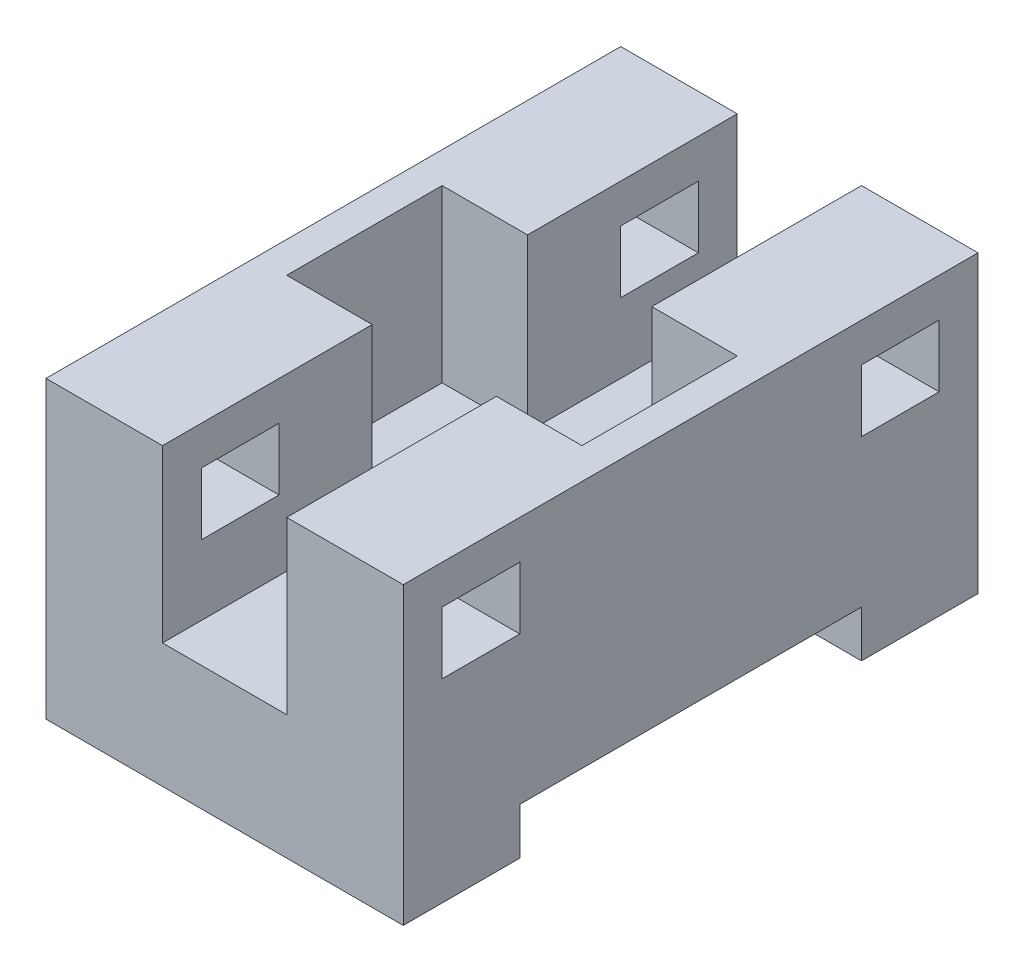
ISO-10303-21;
HEADER;
FILE_DESCRIPTION(('STEP AP214'),'2;1');
FILE_NAME('part.step','',(''),(''),'','','');
FILE_SCHEMA(('AUTOMOTIVE_DESIGN { 1 0 10303 214 1 1 1 1 }'));
ENDSEC;
DATA;
#1=APPLICATION_CONTEXT('core data for automotive mechanical design processes');
#2=APPLICATION_PROTOCOL_DEFINITION('international standard','automotive_design',2000,#1);
#3=PRODUCT_CONTEXT('',#1,'mechanical');
#4=PRODUCT('Part','Part','',(#3));
#5=PRODUCT_RELATED_PRODUCT_CATEGORY('part','',(#4));
#6=PRODUCT_DEFINITION_FORMATION('','',#4);
#7=PRODUCT_DEFINITION_CONTEXT('part definition',#1,'design');
#8=PRODUCT_DEFINITION('design','',#6,#7);
#9=PRODUCT_DEFINITION_SHAPE('','',#8);
#10=(LENGTH_UNIT() NAMED_UNIT(*) SI_UNIT(.MILLI.,.METRE.));
#11=(NAMED_UNIT(*) PLANE_ANGLE_UNIT() SI_UNIT($,.RADIAN.));
#12=(NAMED_UNIT(*) SI_UNIT($,.STERADIAN.) SOLID_ANGLE_UNIT());
#13=UNCERTAINTY_MEASURE_WITH_UNIT(LENGTH_MEASURE(1.E-05),#10,'distance_accuracy_value','');
#14=(GEOMETRIC_REPRESENTATION_CONTEXT(3) GLOBAL_UNCERTAINTY_ASSIGNED_CONTEXT((#13)) GLOBAL_UNIT_ASSIGNED_CONTEXT((#10,
#11,#12)) REPRESENTATION_CONTEXT('',''));
#15=CARTESIAN_POINT('',(0.,0.,0.));
#16=DIRECTION('',(0.,0.,1.));
#17=DIRECTION('',(1.,0.,0.));
#18=AXIS2_PLACEMENT_3D('',#15,#16,#17);
#19=CARTESIAN_POINT('',(23.,19.,37.));
#20=DIRECTION('',(0.,-1.,0.));
#21=DIRECTION('',(0.,0.,-1.));
#22=AXIS2_PLACEMENT_3D('',#19,#20,#21);
#23=PLANE('',#22);
#24=DIRECTION('',(-1.,0.,0.));
#25=VECTOR('',#24,1.);
#26=CARTESIAN_POINT('',(23.,19.,-37.));
#27=LINE('',#26,#25);
#28=CARTESIAN_POINT('',(23.,19.,-37.));
#29=VERTEX_POINT('',#28);
#30=CARTESIAN_POINT('',(8.00000000000001,19.,-37.));
#31=VERTEX_POINT('',#30);
#32=EDGE_CURVE('E529',#29,#31,#27,.T.);
#33=ORIENTED_EDGE('',*,*,#32,.T.);
#34=DIRECTION('',(0.,0.,-1.));
#35=VECTOR('',#34,1.);
#36=CARTESIAN_POINT('',(8.00000000000001,19.,-37.));
#37=LINE('',#36,#35);
#38=CARTESIAN_POINT('',(8.,19.,-10.));
#39=VERTEX_POINT('',#38);
#40=EDGE_CURVE('E387',#39,#31,#37,.T.);
#41=ORIENTED_EDGE('',*,*,#40,.F.);
#42=DIRECTION('',(-1.,0.,0.));
#43=VECTOR('',#42,1.);
#44=CARTESIAN_POINT('',(8.,19.,-10.));
#45=LINE('',#44,#43);
#46=CARTESIAN_POINT('',(19.,19.,-10.));
#47=VERTEX_POINT('',#46);
#48=EDGE_CURVE('E442',#47,#39,#45,.T.);
#49=ORIENTED_EDGE('',*,*,#48,.F.);
#50=DIRECTION('',(0.,0.,-1.));
#51=VECTOR('',#50,1.);
#52=CARTESIAN_POINT('',(19.,19.,-10.));
#53=LINE('',#52,#51);
#54=CARTESIAN_POINT('',(19.,19.,10.));
#55=VERTEX_POINT('',#54);
#56=EDGE_CURVE('E439',#55,#47,#53,.T.);
#57=ORIENTED_EDGE('',*,*,#56,.F.);
#58=DIRECTION('',(1.,0.,0.));
#59=VECTOR('',#58,1.);
#60=CARTESIAN_POINT('',(8.,19.,10.));
#61=LINE('',#60,#59);
#62=CARTESIAN_POINT('',(8.,19.,10.));
#63=VERTEX_POINT('',#62);
#64=EDGE_CURVE('E436',#63,#55,#61,.T.);
#65=ORIENTED_EDGE('',*,*,#64,.F.);
#66=DIRECTION('',(0.,0.,-1.));
#67=VECTOR('',#66,1.);
#68=CARTESIAN_POINT('',(8.,19.,10.));
#69=LINE('',#68,#67);
#70=CARTESIAN_POINT('',(8.,19.,37.));
#71=VERTEX_POINT('',#70);
#72=EDGE_CURVE('E433',#71,#63,#69,.T.);
#73=ORIENTED_EDGE('',*,*,#72,.F.);
#74=DIRECTION('',(-1.,0.,0.));
#75=VECTOR('',#74,1.);
#76=CARTESIAN_POINT('',(23.,19.,37.));
#77=LINE('',#76,#75);
#78=CARTESIAN_POINT('',(23.,19.,37.));
#79=VERTEX_POINT('',#78);
#80=EDGE_CURVE('E525',#79,#71,#77,.T.);
#81=ORIENTED_EDGE('',*,*,#80,.F.);
#82=DIRECTION('',(0.,0.,1.));
#83=VECTOR('',#82,1.);
#84=CARTESIAN_POINT('',(23.,19.,37.));
#85=LINE('',#84,#83);
#86=EDGE_CURVE('E475',#29,#79,#85,.T.);
#87=ORIENTED_EDGE('',*,*,#86,.F.);
#88=EDGE_LOOP('',(#33,#41,#49,#57,#65,#73,#81,#87));
#89=FACE_BOUND('',#88,.T.);
#90=ADVANCED_FACE('F39',(#89),#23,.F.);
#91=CARTESIAN_POINT('',(23.,19.,-37.));
#92=DIRECTION('',(0.,0.,1.));
#93=DIRECTION('',(0.,-1.,0.));
#94=AXIS2_PLACEMENT_3D('',#91,#92,#93);
#95=PLANE('',#94);
#96=CARTESIAN_POINT('',(-8.00000000000001,19.,-37.));
#97=VERTEX_POINT('',#96);
#98=CARTESIAN_POINT('',(-23.,19.,-37.));
#99=VERTEX_POINT('',#98);
#100=EDGE_CURVE('E528',#97,#99,#27,.T.);
#101=ORIENTED_EDGE('',*,*,#100,.F.);
#102=DIRECTION('',(0.,1.,0.));
#103=VECTOR('',#102,1.);
#104=CARTESIAN_POINT('',(-8.00000000000001,-3.,-37.));
#105=LINE('',#104,#103);
#106=CARTESIAN_POINT('',(-8.00000000000001,-3.,-37.));
#107=VERTEX_POINT('',#106);
#108=EDGE_CURVE('E446',#107,#97,#105,.T.);
#109=ORIENTED_EDGE('',*,*,#108,.F.);
#110=DIRECTION('',(-1.,0.,0.));
#111=VECTOR('',#110,1.);
#112=CARTESIAN_POINT('',(-8.00000000000001,-3.,-37.));
#113=LINE('',#112,#111);
#114=CARTESIAN_POINT('',(8.00000000000001,-3.,-37.));
#115=VERTEX_POINT('',#114);
#116=EDGE_CURVE('E416',#115,#107,#113,.T.);
#117=ORIENTED_EDGE('',*,*,#116,.F.);
#118=DIRECTION('',(0.,1.,0.));
#119=VECTOR('',#118,1.);
#120=CARTESIAN_POINT('',(8.00000000000001,-3.,-37.));
#121=LINE('',#120,#119);
#122=EDGE_CURVE('E449',#115,#31,#121,.T.);
#123=ORIENTED_EDGE('',*,*,#122,.T.);
#124=ORIENTED_EDGE('',*,*,#32,.F.);
#125=DIRECTION('',(0.,1.,0.));
#126=VECTOR('',#125,1.);
#127=CARTESIAN_POINT('',(23.,19.,-37.));
#128=LINE('',#127,#126);
#129=CARTESIAN_POINT('',(23.,-19.,-37.));
#130=VERTEX_POINT('',#129);
#131=EDGE_CURVE('E472',#130,#29,#128,.T.);
#132=ORIENTED_EDGE('',*,*,#131,.F.);
#133=DIRECTION('',(-1.,0.,0.));
#134=VECTOR('',#133,1.);
#135=CARTESIAN_POINT('',(23.,-19.,-37.));
#136=LINE('',#135,#134);
#137=CARTESIAN_POINT('',(-23.,-19.,-37.));
#138=VERTEX_POINT('',#137);
#139=EDGE_CURVE('E490',#130,#138,#136,.T.);
#140=ORIENTED_EDGE('',*,*,#139,.T.);
#141=DIRECTION('',(0.,1.,0.));
#142=VECTOR('',#141,1.);
#143=CARTESIAN_POINT('',(-23.,19.,-37.));
#144=LINE('',#143,#142);
#145=EDGE_CURVE('E448',#138,#99,#144,.T.);
#146=ORIENTED_EDGE('',*,*,#145,.T.);
#147=EDGE_LOOP('',(#101,#109,#117,#123,#124,#132,#140,#146));
#148=FACE_BOUND('',#147,.T.);
#149=ADVANCED_FACE('F41',(#148),#95,.F.);
#150=DIRECTION('',(-1.,0.,0.));
#151=VECTOR('',#150,1.);
#152=CARTESIAN_POINT('',(-19.,19.,-10.));
#153=LINE('',#152,#151);
#154=CARTESIAN_POINT('',(-8.,19.,-10.));
#155=VERTEX_POINT('',#154);
#156=CARTESIAN_POINT('',(-19.,19.,-10.));
#157=VERTEX_POINT('',#156);
#158=EDGE_CURVE('E422',#155,#157,#153,.T.);
#159=ORIENTED_EDGE('',*,*,#158,.F.);
#160=DIRECTION('',(0.,0.,1.));
#161=VECTOR('',#160,1.);
#162=CARTESIAN_POINT('',(-8.00000000000001,19.,-37.));
#163=LINE('',#162,#161);
#164=EDGE_CURVE('E382',#97,#155,#163,.T.);
#165=ORIENTED_EDGE('',*,*,#164,.F.);
#166=ORIENTED_EDGE('',*,*,#100,.T.);
#167=DIRECTION('',(0.,0.,1.));
#168=VECTOR('',#167,1.);
#169=CARTESIAN_POINT('',(-23.,19.,37.));
#170=LINE('',#169,#168);
#171=CARTESIAN_POINT('',(-23.,19.,37.));
#172=VERTEX_POINT('',#171);
#173=EDGE_CURVE('E493',#99,#172,#170,.T.);
#174=ORIENTED_EDGE('',*,*,#173,.T.);
#175=CARTESIAN_POINT('',(-8.,19.,37.));
#176=VERTEX_POINT('',#175);
#177=EDGE_CURVE('E524',#176,#172,#77,.T.);
#178=ORIENTED_EDGE('',*,*,#177,.F.);
#179=DIRECTION('',(0.,0.,1.));
#180=VECTOR('',#179,1.);
#181=CARTESIAN_POINT('',(-8.,19.,10.));
#182=LINE('',#181,#180);
#183=CARTESIAN_POINT('',(-8.,19.,10.));
#184=VERTEX_POINT('',#183);
#185=EDGE_CURVE('E431',#184,#176,#182,.T.);
#186=ORIENTED_EDGE('',*,*,#185,.F.);
#187=DIRECTION('',(1.,0.,0.));
#188=VECTOR('',#187,1.);
#189=CARTESIAN_POINT('',(-19.,19.,10.));
#190=LINE('',#189,#188);
#191=CARTESIAN_POINT('',(-19.,19.,10.));
#192=VERTEX_POINT('',#191);
#193=EDGE_CURVE('E428',#192,#184,#190,.T.);
#194=ORIENTED_EDGE('',*,*,#193,.F.);
#195=DIRECTION('',(0.,0.,1.));
#196=VECTOR('',#195,1.);
#197=CARTESIAN_POINT('',(-19.,19.,-10.));
#198=LINE('',#197,#196);
#199=EDGE_CURVE('E425',#157,#192,#198,.T.);
#200=ORIENTED_EDGE('',*,*,#199,.F.);
#201=EDGE_LOOP('',(#159,#165,#166,#174,#178,#186,#194,#200));
#202=FACE_BOUND('',#201,.T.);
#203=ADVANCED_FACE('F581',(#202),#23,.F.);
#204=CARTESIAN_POINT('',(23.,19.,37.));
#205=DIRECTION('',(0.,0.,-1.));
#206=DIRECTION('',(0.,1.,0.));
#207=AXIS2_PLACEMENT_3D('',#204,#205,#206);
#208=PLANE('',#207);
#209=ORIENTED_EDGE('',*,*,#80,.T.);
#210=DIRECTION('',(0.,1.,0.));
#211=VECTOR('',#210,1.);
#212=CARTESIAN_POINT('',(8.,-3.,37.));
#213=LINE('',#212,#211);
#214=CARTESIAN_POINT('',(8.,-3.,37.));
#215=VERTEX_POINT('',#214);
#216=EDGE_CURVE('E460',#215,#71,#213,.T.);
#217=ORIENTED_EDGE('',*,*,#216,.F.);
#218=DIRECTION('',(1.,0.,0.));
#219=VECTOR('',#218,1.);
#220=CARTESIAN_POINT('',(-8.,-3.,37.));
#221=LINE('',#220,#219);
#222=CARTESIAN_POINT('',(-8.,-3.,37.));
#223=VERTEX_POINT('',#222);
#224=EDGE_CURVE('E398',#223,#215,#221,.T.);
#225=ORIENTED_EDGE('',*,*,#224,.F.);
#226=DIRECTION('',(0.,1.,0.));
#227=VECTOR('',#226,1.);
#228=CARTESIAN_POINT('',(-8.,-3.,37.));
#229=LINE('',#228,#227);
#230=EDGE_CURVE('E462',#223,#176,#229,.T.);
#231=ORIENTED_EDGE('',*,*,#230,.T.);
#232=ORIENTED_EDGE('',*,*,#177,.T.);
#233=DIRECTION('',(0.,-1.,0.));
#234=VECTOR('',#233,1.);
#235=CARTESIAN_POINT('',(-23.,19.,37.));
#236=LINE('',#235,#234);
#237=CARTESIAN_POINT('',(-23.,-19.,37.));
#238=VERTEX_POINT('',#237);
#239=EDGE_CURVE('E496',#172,#238,#236,.T.);
#240=ORIENTED_EDGE('',*,*,#239,.T.);
#241=DIRECTION('',(-1.,0.,0.));
#242=VECTOR('',#241,1.);
#243=CARTESIAN_POINT('',(23.,-19.,37.));
#244=LINE('',#243,#242);
#245=CARTESIAN_POINT('',(23.,-19.,37.));
#246=VERTEX_POINT('',#245);
#247=EDGE_CURVE('E521',#246,#238,#244,.T.);
#248=ORIENTED_EDGE('',*,*,#247,.F.);
#249=DIRECTION('',(0.,-1.,0.));
#250=VECTOR('',#249,1.);
#251=CARTESIAN_POINT('',(23.,19.,37.));
#252=LINE('',#251,#250);
#253=EDGE_CURVE('E478',#79,#246,#252,.T.);
#254=ORIENTED_EDGE('',*,*,#253,.F.);
#255=EDGE_LOOP('',(#209,#217,#225,#231,#232,#240,#248,#254));
#256=FACE_BOUND('',#255,.T.);
#257=ADVANCED_FACE('F589',(#256),#208,.F.);
#258=CARTESIAN_POINT('',(23.,-19.,37.));
#259=DIRECTION('',(0.,1.,0.));
#260=DIRECTION('',(0.,0.,1.));
#261=AXIS2_PLACEMENT_3D('',#258,#259,#260);
#262=PLANE('',#261);
#263=DIRECTION('',(0.,0.,-1.));
#264=VECTOR('',#263,1.);
#265=CARTESIAN_POINT('',(-23.,-19.,37.));
#266=LINE('',#265,#264);
#267=CARTESIAN_POINT('',(-23.,-19.,22.));
#268=VERTEX_POINT('',#267);
#269=EDGE_CURVE('E498',#238,#268,#266,.T.);
#270=ORIENTED_EDGE('',*,*,#269,.T.);
#271=DIRECTION('',(-1.,0.,0.));
#272=VECTOR('',#271,1.);
#273=CARTESIAN_POINT('',(23.,-19.,22.));
#274=LINE('',#273,#272);
#275=CARTESIAN_POINT('',(23.,-19.,22.));
#276=VERTEX_POINT('',#275);
#277=EDGE_CURVE('E518',#276,#268,#274,.T.);
#278=ORIENTED_EDGE('',*,*,#277,.F.);
#279=DIRECTION('',(0.,0.,-1.));
#280=VECTOR('',#279,1.);
#281=CARTESIAN_POINT('',(23.,-19.,37.));
#282=LINE('',#281,#280);
#283=EDGE_CURVE('E480',#246,#276,#282,.T.);
#284=ORIENTED_EDGE('',*,*,#283,.F.);
#285=ORIENTED_EDGE('',*,*,#247,.T.);
#286=EDGE_LOOP('',(#270,#278,#284,#285));
#287=FACE_BOUND('',#286,.T.);
#288=ADVANCED_FACE('F594',(#287),#262,.F.);
#289=CARTESIAN_POINT('',(23.,-19.,22.));
#290=DIRECTION('',(0.,0.,1.));
#291=DIRECTION('',(1.,0.,0.));
#292=AXIS2_PLACEMENT_3D('',#289,#290,#291);
#293=PLANE('',#292);
#294=DIRECTION('',(0.,1.,0.));
#295=VECTOR('',#294,1.);
#296=CARTESIAN_POINT('',(-23.,-19.,22.));
#297=LINE('',#296,#295);
#298=CARTESIAN_POINT('',(-23.,-13.,22.));
#299=VERTEX_POINT('',#298);
#300=EDGE_CURVE('E500',#268,#299,#297,.T.);
#301=ORIENTED_EDGE('',*,*,#300,.T.);
#302=DIRECTION('',(-1.,0.,0.));
#303=VECTOR('',#302,1.);
#304=CARTESIAN_POINT('',(23.,-13.,22.));
#305=LINE('',#304,#303);
#306=CARTESIAN_POINT('',(23.,-13.,22.));
#307=VERTEX_POINT('',#306);
#308=EDGE_CURVE('E515',#307,#299,#305,.T.);
#309=ORIENTED_EDGE('',*,*,#308,.F.);
#310=DIRECTION('',(0.,1.,0.));
#311=VECTOR('',#310,1.);
#312=CARTESIAN_POINT('',(23.,-19.,22.));
#313=LINE('',#312,#311);
#314=EDGE_CURVE('E482',#276,#307,#313,.T.);
#315=ORIENTED_EDGE('',*,*,#314,.F.);
#316=ORIENTED_EDGE('',*,*,#277,.T.);
#317=EDGE_LOOP('',(#301,#309,#315,#316));
#318=FACE_BOUND('',#317,.T.);
#319=ADVANCED_FACE('F696',(#318),#293,.F.);
#320=CARTESIAN_POINT('',(23.,-13.,22.));
#321=DIRECTION('',(0.,1.,0.));
#322=DIRECTION('',(0.,0.,1.));
#323=AXIS2_PLACEMENT_3D('',#320,#321,#322);
#324=PLANE('',#323);
#325=DIRECTION('',(0.,0.,-1.));
#326=VECTOR('',#325,1.);
#327=CARTESIAN_POINT('',(-23.,-13.,22.));
#328=LINE('',#327,#326);
#329=CARTESIAN_POINT('',(-23.,-13.,-22.));
#330=VERTEX_POINT('',#329);
#331=EDGE_CURVE('E502',#299,#330,#328,.T.);
#332=ORIENTED_EDGE('',*,*,#331,.T.);
#333=DIRECTION('',(-1.,0.,0.));
#334=VECTOR('',#333,1.);
#335=CARTESIAN_POINT('',(23.,-13.,-22.));
#336=LINE('',#335,#334);
#337=CARTESIAN_POINT('',(23.,-13.,-22.));
#338=VERTEX_POINT('',#337);
#339=EDGE_CURVE('E512',#338,#330,#336,.T.);
#340=ORIENTED_EDGE('',*,*,#339,.F.);
#341=DIRECTION('',(0.,0.,-1.));
#342=VECTOR('',#341,1.);
#343=CARTESIAN_POINT('',(23.,-13.,22.));
#344=LINE('',#343,#342);
#345=EDGE_CURVE('E484',#307,#338,#344,.T.);
#346=ORIENTED_EDGE('',*,*,#345,.F.);
#347=ORIENTED_EDGE('',*,*,#308,.T.);
#348=EDGE_LOOP('',(#332,#340,#346,#347));
#349=FACE_BOUND('',#348,.T.);
#350=ADVANCED_FACE('F692',(#349),#324,.F.);
#351=CARTESIAN_POINT('',(23.,-19.,-22.));
#352=DIRECTION('',(0.,0.,-1.));
#353=DIRECTION('',(-1.,0.,0.));
#354=AXIS2_PLACEMENT_3D('',#351,#352,#353);
#355=PLANE('',#354);
#356=DIRECTION('',(0.,-1.,0.));
#357=VECTOR('',#356,1.);
#358=CARTESIAN_POINT('',(-23.,-19.,-22.));
#359=LINE('',#358,#357);
#360=CARTESIAN_POINT('',(-23.,-19.,-22.));
#361=VERTEX_POINT('',#360);
#362=EDGE_CURVE('E504',#330,#361,#359,.T.);
#363=ORIENTED_EDGE('',*,*,#362,.T.);
#364=DIRECTION('',(-1.,0.,0.));
#365=VECTOR('',#364,1.);
#366=CARTESIAN_POINT('',(23.,-19.,-22.));
#367=LINE('',#366,#365);
#368=CARTESIAN_POINT('',(23.,-19.,-22.));
#369=VERTEX_POINT('',#368);
#370=EDGE_CURVE('E509',#369,#361,#367,.T.);
#371=ORIENTED_EDGE('',*,*,#370,.F.);
#372=DIRECTION('',(0.,-1.,0.));
#373=VECTOR('',#372,1.);
#374=CARTESIAN_POINT('',(23.,-19.,-22.));
#375=LINE('',#374,#373);
#376=EDGE_CURVE('E486',#338,#369,#375,.T.);
#377=ORIENTED_EDGE('',*,*,#376,.F.);
#378=ORIENTED_EDGE('',*,*,#339,.T.);
#379=EDGE_LOOP('',(#363,#371,#377,#378));
#380=FACE_BOUND('',#379,.T.);
#381=ADVANCED_FACE('F688',(#380),#355,.F.);
#382=CARTESIAN_POINT('',(23.,-19.,-22.));
#383=DIRECTION('',(0.,1.,0.));
#384=DIRECTION('',(0.,0.,1.));
#385=AXIS2_PLACEMENT_3D('',#382,#383,#384);
#386=PLANE('',#385);
#387=DIRECTION('',(0.,0.,-1.));
#388=VECTOR('',#387,1.);
#389=CARTESIAN_POINT('',(-23.,-19.,-22.));
#390=LINE('',#389,#388);
#391=EDGE_CURVE('E476',#361,#138,#390,.T.);
#392=ORIENTED_EDGE('',*,*,#391,.T.);
#393=ORIENTED_EDGE('',*,*,#139,.F.);
#394=DIRECTION('',(0.,0.,-1.));
#395=VECTOR('',#394,1.);
#396=CARTESIAN_POINT('',(23.,-19.,-22.));
#397=LINE('',#396,#395);
#398=EDGE_CURVE('E488',#369,#130,#397,.T.);
#399=ORIENTED_EDGE('',*,*,#398,.F.);
#400=ORIENTED_EDGE('',*,*,#370,.T.);
#401=EDGE_LOOP('',(#392,#393,#399,#400));
#402=FACE_BOUND('',#401,.T.);
#403=ADVANCED_FACE('F684',(#402),#386,.F.);
#404=CARTESIAN_POINT('',(23.,0.,0.));
#405=DIRECTION('',(1.,0.,0.));
#406=DIRECTION('',(0.,0.,-1.));
#407=AXIS2_PLACEMENT_3D('',#404,#405,#406);
#408=PLANE('',#407);
#409=DIRECTION('',(0.,-1.,0.));
#410=VECTOR('',#409,1.);
#411=CARTESIAN_POINT('',(23.,14.,-22.));
#412=LINE('',#411,#410);
#413=CARTESIAN_POINT('',(23.,14.,-22.));
#414=VERTEX_POINT('',#413);
#415=CARTESIAN_POINT('',(23.,6.,-22.));
#416=VERTEX_POINT('',#415);
#417=EDGE_CURVE('E54',#414,#416,#412,.T.);
#418=ORIENTED_EDGE('',*,*,#417,.F.);
#419=DIRECTION('',(0.,0.,1.));
#420=VECTOR('',#419,1.);
#421=CARTESIAN_POINT('',(23.,14.,-22.));
#422=LINE('',#421,#420);
#423=CARTESIAN_POINT('',(23.,14.,-32.));
#424=VERTEX_POINT('',#423);
#425=EDGE_CURVE('E302',#424,#414,#422,.T.);
#426=ORIENTED_EDGE('',*,*,#425,.F.);
#427=DIRECTION('',(0.,1.,0.));
#428=VECTOR('',#427,1.);
#429=CARTESIAN_POINT('',(23.,14.,-32.));
#430=LINE('',#429,#428);
#431=CARTESIAN_POINT('',(23.,6.,-32.));
#432=VERTEX_POINT('',#431);
#433=EDGE_CURVE('E305',#432,#424,#430,.T.);
#434=ORIENTED_EDGE('',*,*,#433,.F.);
#435=DIRECTION('',(0.,0.,-1.));
#436=VECTOR('',#435,1.);
#437=CARTESIAN_POINT('',(23.,6.,-22.));
#438=LINE('',#437,#436);
#439=EDGE_CURVE('E311',#416,#432,#438,.T.);
#440=ORIENTED_EDGE('',*,*,#439,.F.);
#441=EDGE_LOOP('',(#418,#426,#434,#440));
#442=FACE_BOUND('',#441,.T.);
#443=DIRECTION('',(0.,1.,0.));
#444=VECTOR('',#443,1.);
#445=CARTESIAN_POINT('',(23.,14.,22.));
#446=LINE('',#445,#444);
#447=CARTESIAN_POINT('',(23.,6.,22.));
#448=VERTEX_POINT('',#447);
#449=CARTESIAN_POINT('',(23.,14.,22.));
#450=VERTEX_POINT('',#449);
#451=EDGE_CURVE('E62',#448,#450,#446,.T.);
#452=ORIENTED_EDGE('',*,*,#451,.F.);
#453=DIRECTION('',(0.,0.,-1.));
#454=VECTOR('',#453,1.);
#455=CARTESIAN_POINT('',(23.,6.,22.));
#456=LINE('',#455,#454);
#457=CARTESIAN_POINT('',(23.,6.,32.));
#458=VERTEX_POINT('',#457);
#459=EDGE_CURVE('E330',#458,#448,#456,.T.);
#460=ORIENTED_EDGE('',*,*,#459,.F.);
#461=DIRECTION('',(0.,-1.,0.));
#462=VECTOR('',#461,1.);
#463=CARTESIAN_POINT('',(23.,14.,32.));
#464=LINE('',#463,#462);
#465=CARTESIAN_POINT('',(23.,14.,32.));
#466=VERTEX_POINT('',#465);
#467=EDGE_CURVE('E344',#466,#458,#464,.T.);
#468=ORIENTED_EDGE('',*,*,#467,.F.);
#469=DIRECTION('',(0.,0.,1.));
#470=VECTOR('',#469,1.);
#471=CARTESIAN_POINT('',(23.,14.,22.));
#472=LINE('',#471,#470);
#473=EDGE_CURVE('E341',#450,#466,#472,.T.);
#474=ORIENTED_EDGE('',*,*,#473,.F.);
#475=EDGE_LOOP('',(#452,#460,#468,#474));
#476=FACE_BOUND('',#475,.T.);
#477=ORIENTED_EDGE('',*,*,#131,.T.);
#478=ORIENTED_EDGE('',*,*,#86,.T.);
#479=ORIENTED_EDGE('',*,*,#253,.T.);
#480=ORIENTED_EDGE('',*,*,#283,.T.);
#481=ORIENTED_EDGE('',*,*,#314,.T.);
#482=ORIENTED_EDGE('',*,*,#345,.T.);
#483=ORIENTED_EDGE('',*,*,#376,.T.);
#484=ORIENTED_EDGE('',*,*,#398,.T.);
#485=EDGE_LOOP('',(#477,#478,#479,#480,#481,#482,#483,#484));
#486=FACE_BOUND('',#485,.T.);
#487=ADVANCED_FACE('F564',(#442,#476,#486),#408,.T.);
#488=CARTESIAN_POINT('',(-23.,0.,0.));
#489=DIRECTION('',(1.,0.,0.));
#490=DIRECTION('',(0.,0.,-1.));
#491=AXIS2_PLACEMENT_3D('',#488,#489,#490);
#492=PLANE('',#491);
#493=DIRECTION('',(0.,0.,1.));
#494=VECTOR('',#493,1.);
#495=CARTESIAN_POINT('',(-23.,14.,-22.));
#496=LINE('',#495,#494);
#497=CARTESIAN_POINT('',(-23.,14.,-32.));
#498=VERTEX_POINT('',#497);
#499=CARTESIAN_POINT('',(-23.,14.,-22.));
#500=VERTEX_POINT('',#499);
#501=EDGE_CURVE('E301',#498,#500,#496,.T.);
#502=ORIENTED_EDGE('',*,*,#501,.T.);
#503=DIRECTION('',(0.,-1.,0.));
#504=VECTOR('',#503,1.);
#505=CARTESIAN_POINT('',(-23.,14.,-22.));
#506=LINE('',#505,#504);
#507=CARTESIAN_POINT('',(-23.,6.,-22.));
#508=VERTEX_POINT('',#507);
#509=EDGE_CURVE('E279',#500,#508,#506,.T.);
#510=ORIENTED_EDGE('',*,*,#509,.T.);
#511=DIRECTION('',(0.,0.,-1.));
#512=VECTOR('',#511,1.);
#513=CARTESIAN_POINT('',(-23.,6.,-22.));
#514=LINE('',#513,#512);
#515=CARTESIAN_POINT('',(-23.,6.,-32.));
#516=VERTEX_POINT('',#515);
#517=EDGE_CURVE('E290',#508,#516,#514,.T.);
#518=ORIENTED_EDGE('',*,*,#517,.T.);
#519=DIRECTION('',(0.,1.,0.));
#520=VECTOR('',#519,1.);
#521=CARTESIAN_POINT('',(-23.,14.,-32.));
#522=LINE('',#521,#520);
#523=EDGE_CURVE('E296',#516,#498,#522,.T.);
#524=ORIENTED_EDGE('',*,*,#523,.T.);
#525=EDGE_LOOP('',(#502,#510,#518,#524));
#526=FACE_BOUND('',#525,.T.);
#527=DIRECTION('',(0.,0.,-1.));
#528=VECTOR('',#527,1.);
#529=CARTESIAN_POINT('',(-23.,6.,22.));
#530=LINE('',#529,#528);
#531=CARTESIAN_POINT('',(-23.,6.,32.));
#532=VERTEX_POINT('',#531);
#533=CARTESIAN_POINT('',(-23.,6.,22.));
#534=VERTEX_POINT('',#533);
#535=EDGE_CURVE('E336',#532,#534,#530,.T.);
#536=ORIENTED_EDGE('',*,*,#535,.T.);
#537=DIRECTION('',(0.,1.,0.));
#538=VECTOR('',#537,1.);
#539=CARTESIAN_POINT('',(-23.,14.,22.));
#540=LINE('',#539,#538);
#541=CARTESIAN_POINT('',(-23.,14.,22.));
#542=VERTEX_POINT('',#541);
#543=EDGE_CURVE('E326',#534,#542,#540,.T.);
#544=ORIENTED_EDGE('',*,*,#543,.T.);
#545=DIRECTION('',(0.,0.,1.));
#546=VECTOR('',#545,1.);
#547=CARTESIAN_POINT('',(-23.,14.,22.));
#548=LINE('',#547,#546);
#549=CARTESIAN_POINT('',(-23.,14.,32.));
#550=VERTEX_POINT('',#549);
#551=EDGE_CURVE('E329',#542,#550,#548,.T.);
#552=ORIENTED_EDGE('',*,*,#551,.T.);
#553=DIRECTION('',(0.,-1.,0.));
#554=VECTOR('',#553,1.);
#555=CARTESIAN_POINT('',(-23.,14.,32.));
#556=LINE('',#555,#554);
#557=EDGE_CURVE('E333',#550,#532,#556,.T.);
#558=ORIENTED_EDGE('',*,*,#557,.T.);
#559=EDGE_LOOP('',(#536,#544,#552,#558));
#560=FACE_BOUND('',#559,.T.);
#561=ORIENTED_EDGE('',*,*,#145,.F.);
#562=ORIENTED_EDGE('',*,*,#391,.F.);
#563=ORIENTED_EDGE('',*,*,#362,.F.);
#564=ORIENTED_EDGE('',*,*,#331,.F.);
#565=ORIENTED_EDGE('',*,*,#300,.F.);
#566=ORIENTED_EDGE('',*,*,#269,.F.);
#567=ORIENTED_EDGE('',*,*,#239,.F.);
#568=ORIENTED_EDGE('',*,*,#173,.F.);
#569=EDGE_LOOP('',(#561,#562,#563,#564,#565,#566,#567,#568));
#570=FACE_BOUND('',#569,.T.);
#571=ADVANCED_FACE('F298',(#526,#560,#570),#492,.F.);
#572=CARTESIAN_POINT('',(-8.00000000000001,-3.,-37.));
#573=DIRECTION('',(-1.,0.,0.));
#574=DIRECTION('',(0.,0.,1.));
#575=AXIS2_PLACEMENT_3D('',#572,#573,#574);
#576=PLANE('',#575);
#577=DIRECTION('',(0.,0.,1.));
#578=VECTOR('',#577,1.);
#579=CARTESIAN_POINT('',(-8.00000000000001,6.,-37.));
#580=LINE('',#579,#578);
#581=CARTESIAN_POINT('',(-8.00000000000001,6.,-32.));
#582=VERTEX_POINT('',#581);
#583=CARTESIAN_POINT('',(-8.00000000000001,6.,-22.));
#584=VERTEX_POINT('',#583);
#585=EDGE_CURVE('E373',#582,#584,#580,.T.);
#586=ORIENTED_EDGE('',*,*,#585,.T.);
#587=DIRECTION('',(0.,1.,0.));
#588=VECTOR('',#587,1.);
#589=CARTESIAN_POINT('',(-8.00000000000001,-2.99999999999999,-22.));
#590=LINE('',#589,#588);
#591=CARTESIAN_POINT('',(-8.00000000000001,14.,-22.));
#592=VERTEX_POINT('',#591);
#593=EDGE_CURVE('E282',#584,#592,#590,.T.);
#594=ORIENTED_EDGE('',*,*,#593,.T.);
#595=DIRECTION('',(0.,0.,-1.));
#596=VECTOR('',#595,1.);
#597=CARTESIAN_POINT('',(-8.00000000000001,14.,-37.));
#598=LINE('',#597,#596);
#599=CARTESIAN_POINT('',(-8.00000000000001,14.,-32.));
#600=VERTEX_POINT('',#599);
#601=EDGE_CURVE('E378',#592,#600,#598,.T.);
#602=ORIENTED_EDGE('',*,*,#601,.T.);
#603=DIRECTION('',(0.,-1.,0.));
#604=VECTOR('',#603,1.);
#605=CARTESIAN_POINT('',(-8.00000000000001,-3.,-32.));
#606=LINE('',#605,#604);
#607=EDGE_CURVE('E375',#600,#582,#606,.T.);
#608=ORIENTED_EDGE('',*,*,#607,.T.);
#609=EDGE_LOOP('',(#586,#594,#602,#608));
#610=FACE_BOUND('',#609,.T.);
#611=ORIENTED_EDGE('',*,*,#164,.T.);
#612=DIRECTION('',(0.,1.,0.));
#613=VECTOR('',#612,1.);
#614=CARTESIAN_POINT('',(-8.,-3.,-10.));
#615=LINE('',#614,#613);
#616=CARTESIAN_POINT('',(-8.,-3.,-10.));
#617=VERTEX_POINT('',#616);
#618=EDGE_CURVE('E419',#617,#155,#615,.T.);
#619=ORIENTED_EDGE('',*,*,#618,.F.);
#620=DIRECTION('',(0.,0.,1.));
#621=VECTOR('',#620,1.);
#622=CARTESIAN_POINT('',(-8.00000000000001,-3.,-37.));
#623=LINE('',#622,#621);
#624=EDGE_CURVE('E383',#107,#617,#623,.T.);
#625=ORIENTED_EDGE('',*,*,#624,.F.);
#626=ORIENTED_EDGE('',*,*,#108,.T.);
#627=EDGE_LOOP('',(#611,#619,#625,#626));
#628=FACE_BOUND('',#627,.T.);
#629=ADVANCED_FACE('F606',(#610,#628),#576,.F.);
#630=CARTESIAN_POINT('',(8.00000000000001,-3.,-37.));
#631=DIRECTION('',(1.,0.,0.));
#632=DIRECTION('',(0.,0.,-1.));
#633=AXIS2_PLACEMENT_3D('',#630,#631,#632);
#634=PLANE('',#633);
#635=DIRECTION('',(0.,0.,1.));
#636=VECTOR('',#635,1.);
#637=CARTESIAN_POINT('',(8.00000000000001,14.,-37.));
#638=LINE('',#637,#636);
#639=CARTESIAN_POINT('',(8.00000000000001,14.,-32.));
#640=VERTEX_POINT('',#639);
#641=CARTESIAN_POINT('',(8.00000000000001,14.,-22.));
#642=VERTEX_POINT('',#641);
#643=EDGE_CURVE('E47',#640,#642,#638,.T.);
#644=ORIENTED_EDGE('',*,*,#643,.T.);
#645=DIRECTION('',(0.,-1.,0.));
#646=VECTOR('',#645,1.);
#647=CARTESIAN_POINT('',(8.00000000000001,-2.99999999999999,-22.));
#648=LINE('',#647,#646);
#649=CARTESIAN_POINT('',(8.00000000000001,6.,-22.));
#650=VERTEX_POINT('',#649);
#651=EDGE_CURVE('E11',#642,#650,#648,.T.);
#652=ORIENTED_EDGE('',*,*,#651,.T.);
#653=DIRECTION('',(0.,0.,-1.));
#654=VECTOR('',#653,1.);
#655=CARTESIAN_POINT('',(8.00000000000001,6.,-37.));
#656=LINE('',#655,#654);
#657=CARTESIAN_POINT('',(8.00000000000001,6.,-32.));
#658=VERTEX_POINT('',#657);
#659=EDGE_CURVE('E544',#650,#658,#656,.T.);
#660=ORIENTED_EDGE('',*,*,#659,.T.);
#661=DIRECTION('',(0.,1.,0.));
#662=VECTOR('',#661,1.);
#663=CARTESIAN_POINT('',(8.00000000000001,-3.,-32.));
#664=LINE('',#663,#662);
#665=EDGE_CURVE('E547',#658,#640,#664,.T.);
#666=ORIENTED_EDGE('',*,*,#665,.T.);
#667=EDGE_LOOP('',(#644,#652,#660,#666));
#668=FACE_BOUND('',#667,.T.);
#669=ORIENTED_EDGE('',*,*,#40,.T.);
#670=ORIENTED_EDGE('',*,*,#122,.F.);
#671=DIRECTION('',(0.,0.,-1.));
#672=VECTOR('',#671,1.);
#673=CARTESIAN_POINT('',(8.00000000000001,-3.,-37.));
#674=LINE('',#673,#672);
#675=CARTESIAN_POINT('',(8.,-3.,-10.));
#676=VERTEX_POINT('',#675);
#677=EDGE_CURVE('E413',#676,#115,#674,.T.);
#678=ORIENTED_EDGE('',*,*,#677,.F.);
#679=DIRECTION('',(0.,1.,0.));
#680=VECTOR('',#679,1.);
#681=CARTESIAN_POINT('',(8.,-3.,-10.));
#682=LINE('',#681,#680);
#683=EDGE_CURVE('E452',#676,#39,#682,.T.);
#684=ORIENTED_EDGE('',*,*,#683,.T.);
#685=EDGE_LOOP('',(#669,#670,#678,#684));
#686=FACE_BOUND('',#685,.T.);
#687=ADVANCED_FACE('F551',(#668,#686),#634,.F.);
#688=CARTESIAN_POINT('',(8.,-3.,-10.));
#689=DIRECTION('',(0.,0.,-1.));
#690=DIRECTION('',(0.,1.,0.));
#691=AXIS2_PLACEMENT_3D('',#688,#689,#690);
#692=PLANE('',#691);
#693=ORIENTED_EDGE('',*,*,#48,.T.);
#694=ORIENTED_EDGE('',*,*,#683,.F.);
#695=DIRECTION('',(-1.,0.,0.));
#696=VECTOR('',#695,1.);
#697=CARTESIAN_POINT('',(8.,-3.,-10.));
#698=LINE('',#697,#696);
#699=CARTESIAN_POINT('',(19.,-3.,-10.));
#700=VERTEX_POINT('',#699);
#701=EDGE_CURVE('E410',#700,#676,#698,.T.);
#702=ORIENTED_EDGE('',*,*,#701,.F.);
#703=DIRECTION('',(0.,1.,0.));
#704=VECTOR('',#703,1.);
#705=CARTESIAN_POINT('',(19.,-3.,-10.));
#706=LINE('',#705,#704);
#707=EDGE_CURVE('E454',#700,#47,#706,.T.);
#708=ORIENTED_EDGE('',*,*,#707,.T.);
#709=EDGE_LOOP('',(#693,#694,#702,#708));
#710=FACE_BOUND('',#709,.T.);
#711=ADVANCED_FACE('F653',(#710),#692,.F.);
#712=CARTESIAN_POINT('',(19.,-3.,-10.));
#713=DIRECTION('',(1.,0.,0.));
#714=DIRECTION('',(0.,0.,-1.));
#715=AXIS2_PLACEMENT_3D('',#712,#713,#714);
#716=PLANE('',#715);
#717=ORIENTED_EDGE('',*,*,#56,.T.);
#718=ORIENTED_EDGE('',*,*,#707,.F.);
#719=DIRECTION('',(0.,0.,-1.));
#720=VECTOR('',#719,1.);
#721=CARTESIAN_POINT('',(19.,-3.,-10.));
#722=LINE('',#721,#720);
#723=CARTESIAN_POINT('',(19.,-3.,10.));
#724=VERTEX_POINT('',#723);
#725=EDGE_CURVE('E407',#724,#700,#722,.T.);
#726=ORIENTED_EDGE('',*,*,#725,.F.);
#727=DIRECTION('',(0.,1.,0.));
#728=VECTOR('',#727,1.);
#729=CARTESIAN_POINT('',(19.,-3.,10.));
#730=LINE('',#729,#728);
#731=EDGE_CURVE('E456',#724,#55,#730,.T.);
#732=ORIENTED_EDGE('',*,*,#731,.T.);
#733=EDGE_LOOP('',(#717,#718,#726,#732));
#734=FACE_BOUND('',#733,.T.);
#735=ADVANCED_FACE('F656',(#734),#716,.F.);
#736=CARTESIAN_POINT('',(8.,-3.,10.));
#737=DIRECTION('',(0.,0.,1.));
#738=DIRECTION('',(0.,-1.,0.));
#739=AXIS2_PLACEMENT_3D('',#736,#737,#738);
#740=PLANE('',#739);
#741=ORIENTED_EDGE('',*,*,#64,.T.);
#742=ORIENTED_EDGE('',*,*,#731,.F.);
#743=DIRECTION('',(1.,0.,0.));
#744=VECTOR('',#743,1.);
#745=CARTESIAN_POINT('',(8.,-3.,10.));
#746=LINE('',#745,#744);
#747=CARTESIAN_POINT('',(8.,-3.,10.));
#748=VERTEX_POINT('',#747);
#749=EDGE_CURVE('E404',#748,#724,#746,.T.);
#750=ORIENTED_EDGE('',*,*,#749,.F.);
#751=DIRECTION('',(0.,1.,0.));
#752=VECTOR('',#751,1.);
#753=CARTESIAN_POINT('',(8.,-3.,10.));
#754=LINE('',#753,#752);
#755=EDGE_CURVE('E458',#748,#63,#754,.T.);
#756=ORIENTED_EDGE('',*,*,#755,.T.);
#757=EDGE_LOOP('',(#741,#742,#750,#756));
#758=FACE_BOUND('',#757,.T.);
#759=ADVANCED_FACE('F658',(#758),#740,.F.);
#760=CARTESIAN_POINT('',(8.,-3.,10.));
#761=DIRECTION('',(1.,0.,0.));
#762=DIRECTION('',(0.,0.,-1.));
#763=AXIS2_PLACEMENT_3D('',#760,#761,#762);
#764=PLANE('',#763);
#765=DIRECTION('',(0.,0.,-1.));
#766=VECTOR('',#765,1.);
#767=CARTESIAN_POINT('',(8.,6.,10.));
#768=LINE('',#767,#766);
#769=CARTESIAN_POINT('',(8.,6.,32.));
#770=VERTEX_POINT('',#769);
#771=CARTESIAN_POINT('',(8.,6.,22.));
#772=VERTEX_POINT('',#771);
#773=EDGE_CURVE('E367',#770,#772,#768,.T.);
#774=ORIENTED_EDGE('',*,*,#773,.T.);
#775=DIRECTION('',(0.,1.,0.));
#776=VECTOR('',#775,1.);
#777=CARTESIAN_POINT('',(8.,-3.,22.));
#778=LINE('',#777,#776);
#779=CARTESIAN_POINT('',(8.,14.,22.));
#780=VERTEX_POINT('',#779);
#781=EDGE_CURVE('E370',#772,#780,#778,.T.);
#782=ORIENTED_EDGE('',*,*,#781,.T.);
#783=DIRECTION('',(0.,0.,1.));
#784=VECTOR('',#783,1.);
#785=CARTESIAN_POINT('',(8.,14.,10.));
#786=LINE('',#785,#784);
#787=CARTESIAN_POINT('',(8.,14.,32.));
#788=VERTEX_POINT('',#787);
#789=EDGE_CURVE('E319',#780,#788,#786,.T.);
#790=ORIENTED_EDGE('',*,*,#789,.T.);
#791=DIRECTION('',(0.,-1.,0.));
#792=VECTOR('',#791,1.);
#793=CARTESIAN_POINT('',(8.,-3.,32.));
#794=LINE('',#793,#792);
#795=EDGE_CURVE('E364',#788,#770,#794,.T.);
#796=ORIENTED_EDGE('',*,*,#795,.T.);
#797=EDGE_LOOP('',(#774,#782,#790,#796));
#798=FACE_BOUND('',#797,.T.);
#799=ORIENTED_EDGE('',*,*,#72,.T.);
#800=ORIENTED_EDGE('',*,*,#755,.F.);
#801=DIRECTION('',(0.,0.,-1.));
#802=VECTOR('',#801,1.);
#803=CARTESIAN_POINT('',(8.,-3.,10.));
#804=LINE('',#803,#802);
#805=EDGE_CURVE('E401',#215,#748,#804,.T.);
#806=ORIENTED_EDGE('',*,*,#805,.F.);
#807=ORIENTED_EDGE('',*,*,#216,.T.);
#808=EDGE_LOOP('',(#799,#800,#806,#807));
#809=FACE_BOUND('',#808,.T.);
#810=ADVANCED_FACE('F632',(#798,#809),#764,.F.);
#811=CARTESIAN_POINT('',(-8.,-3.,10.));
#812=DIRECTION('',(-1.,0.,0.));
#813=DIRECTION('',(0.,0.,1.));
#814=AXIS2_PLACEMENT_3D('',#811,#812,#813);
#815=PLANE('',#814);
#816=DIRECTION('',(0.,0.,-1.));
#817=VECTOR('',#816,1.);
#818=CARTESIAN_POINT('',(-8.,14.,10.));
#819=LINE('',#818,#817);
#820=CARTESIAN_POINT('',(-8.,14.,32.));
#821=VERTEX_POINT('',#820);
#822=CARTESIAN_POINT('',(-8.,14.,22.));
#823=VERTEX_POINT('',#822);
#824=EDGE_CURVE('E532',#821,#823,#819,.T.);
#825=ORIENTED_EDGE('',*,*,#824,.T.);
#826=DIRECTION('',(0.,-1.,0.));
#827=VECTOR('',#826,1.);
#828=CARTESIAN_POINT('',(-8.,-3.,22.));
#829=LINE('',#828,#827);
#830=CARTESIAN_POINT('',(-8.,6.,22.));
#831=VERTEX_POINT('',#830);
#832=EDGE_CURVE('E541',#823,#831,#829,.T.);
#833=ORIENTED_EDGE('',*,*,#832,.T.);
#834=DIRECTION('',(0.,0.,1.));
#835=VECTOR('',#834,1.);
#836=CARTESIAN_POINT('',(-8.,6.,10.));
#837=LINE('',#836,#835);
#838=CARTESIAN_POINT('',(-8.,6.,32.));
#839=VERTEX_POINT('',#838);
#840=EDGE_CURVE('E538',#831,#839,#837,.T.);
#841=ORIENTED_EDGE('',*,*,#840,.T.);
#842=DIRECTION('',(0.,1.,0.));
#843=VECTOR('',#842,1.);
#844=CARTESIAN_POINT('',(-8.,-3.,32.));
#845=LINE('',#844,#843);
#846=EDGE_CURVE('E535',#839,#821,#845,.T.);
#847=ORIENTED_EDGE('',*,*,#846,.T.);
#848=EDGE_LOOP('',(#825,#833,#841,#847));
#849=FACE_BOUND('',#848,.T.);
#850=ORIENTED_EDGE('',*,*,#185,.T.);
#851=ORIENTED_EDGE('',*,*,#230,.F.);
#852=DIRECTION('',(0.,0.,1.));
#853=VECTOR('',#852,1.);
#854=CARTESIAN_POINT('',(-8.,-3.,10.));
#855=LINE('',#854,#853);
#856=CARTESIAN_POINT('',(-8.,-3.,10.));
#857=VERTEX_POINT('',#856);
#858=EDGE_CURVE('E396',#857,#223,#855,.T.);
#859=ORIENTED_EDGE('',*,*,#858,.F.);
#860=DIRECTION('',(0.,1.,0.));
#861=VECTOR('',#860,1.);
#862=CARTESIAN_POINT('',(-8.,-3.,10.));
#863=LINE('',#862,#861);
#864=EDGE_CURVE('E465',#857,#184,#863,.T.);
#865=ORIENTED_EDGE('',*,*,#864,.T.);
#866=EDGE_LOOP('',(#850,#851,#859,#865));
#867=FACE_BOUND('',#866,.T.);
#868=ADVANCED_FACE('F640',(#849,#867),#815,.F.);
#869=CARTESIAN_POINT('',(-19.,-3.,10.));
#870=DIRECTION('',(0.,0.,1.));
#871=DIRECTION('',(0.,-1.,0.));
#872=AXIS2_PLACEMENT_3D('',#869,#870,#871);
#873=PLANE('',#872);
#874=ORIENTED_EDGE('',*,*,#193,.T.);
#875=ORIENTED_EDGE('',*,*,#864,.F.);
#876=DIRECTION('',(1.,0.,0.));
#877=VECTOR('',#876,1.);
#878=CARTESIAN_POINT('',(-19.,-3.,10.));
#879=LINE('',#878,#877);
#880=CARTESIAN_POINT('',(-19.,-3.,10.));
#881=VERTEX_POINT('',#880);
#882=EDGE_CURVE('E393',#881,#857,#879,.T.);
#883=ORIENTED_EDGE('',*,*,#882,.F.);
#884=DIRECTION('',(0.,1.,0.));
#885=VECTOR('',#884,1.);
#886=CARTESIAN_POINT('',(-19.,-3.,10.));
#887=LINE('',#886,#885);
#888=EDGE_CURVE('E467',#881,#192,#887,.T.);
#889=ORIENTED_EDGE('',*,*,#888,.T.);
#890=EDGE_LOOP('',(#874,#875,#883,#889));
#891=FACE_BOUND('',#890,.T.);
#892=ADVANCED_FACE('F643',(#891),#873,.F.);
#893=CARTESIAN_POINT('',(-19.,-3.,-10.));
#894=DIRECTION('',(-1.,0.,0.));
#895=DIRECTION('',(0.,0.,1.));
#896=AXIS2_PLACEMENT_3D('',#893,#894,#895);
#897=PLANE('',#896);
#898=ORIENTED_EDGE('',*,*,#199,.T.);
#899=ORIENTED_EDGE('',*,*,#888,.F.);
#900=DIRECTION('',(0.,0.,1.));
#901=VECTOR('',#900,1.);
#902=CARTESIAN_POINT('',(-19.,-3.,-10.));
#903=LINE('',#902,#901);
#904=CARTESIAN_POINT('',(-19.,-3.,-10.));
#905=VERTEX_POINT('',#904);
#906=EDGE_CURVE('E390',#905,#881,#903,.T.);
#907=ORIENTED_EDGE('',*,*,#906,.F.);
#908=DIRECTION('',(0.,1.,0.));
#909=VECTOR('',#908,1.);
#910=CARTESIAN_POINT('',(-19.,-3.,-10.));
#911=LINE('',#910,#909);
#912=EDGE_CURVE('E469',#905,#157,#911,.T.);
#913=ORIENTED_EDGE('',*,*,#912,.T.);
#914=EDGE_LOOP('',(#898,#899,#907,#913));
#915=FACE_BOUND('',#914,.T.);
#916=ADVANCED_FACE('F645',(#915),#897,.F.);
#917=CARTESIAN_POINT('',(-19.,-3.,-10.));
#918=DIRECTION('',(0.,0.,-1.));
#919=DIRECTION('',(0.,1.,0.));
#920=AXIS2_PLACEMENT_3D('',#917,#918,#919);
#921=PLANE('',#920);
#922=ORIENTED_EDGE('',*,*,#158,.T.);
#923=ORIENTED_EDGE('',*,*,#912,.F.);
#924=DIRECTION('',(-1.,0.,0.));
#925=VECTOR('',#924,1.);
#926=CARTESIAN_POINT('',(-19.,-3.,-10.));
#927=LINE('',#926,#925);
#928=EDGE_CURVE('E386',#617,#905,#927,.T.);
#929=ORIENTED_EDGE('',*,*,#928,.F.);
#930=ORIENTED_EDGE('',*,*,#618,.T.);
#931=EDGE_LOOP('',(#922,#923,#929,#930));
#932=FACE_BOUND('',#931,.T.);
#933=ADVANCED_FACE('F602',(#932),#921,.F.);
#934=CARTESIAN_POINT('',(0.,-3.,0.));
#935=DIRECTION('',(0.,1.,0.));
#936=DIRECTION('',(0.,0.,1.));
#937=AXIS2_PLACEMENT_3D('',#934,#935,#936);
#938=PLANE('',#937);
#939=ORIENTED_EDGE('',*,*,#624,.T.);
#940=ORIENTED_EDGE('',*,*,#928,.T.);
#941=ORIENTED_EDGE('',*,*,#906,.T.);
#942=ORIENTED_EDGE('',*,*,#882,.T.);
#943=ORIENTED_EDGE('',*,*,#858,.T.);
#944=ORIENTED_EDGE('',*,*,#224,.T.);
#945=ORIENTED_EDGE('',*,*,#805,.T.);
#946=ORIENTED_EDGE('',*,*,#749,.T.);
#947=ORIENTED_EDGE('',*,*,#725,.T.);
#948=ORIENTED_EDGE('',*,*,#701,.T.);
#949=ORIENTED_EDGE('',*,*,#677,.T.);
#950=ORIENTED_EDGE('',*,*,#116,.T.);
#951=EDGE_LOOP('',(#939,#940,#941,#942,#943,#944,#945,#946,#947,#948,#949,#950));
#952=FACE_BOUND('',#951,.T.);
#953=ADVANCED_FACE('F635',(#952),#938,.T.);
#954=CARTESIAN_POINT('',(-23.,14.,22.));
#955=DIRECTION('',(0.,1.,0.));
#956=DIRECTION('',(0.,0.,1.));
#957=AXIS2_PLACEMENT_3D('',#954,#955,#956);
#958=PLANE('',#957);
#959=DIRECTION('',(1.,0.,0.));
#960=VECTOR('',#959,1.);
#961=CARTESIAN_POINT('',(-23.,14.,32.));
#962=LINE('',#961,#960);
#963=EDGE_CURVE('E356',#550,#821,#962,.T.);
#964=ORIENTED_EDGE('',*,*,#963,.F.);
#965=ORIENTED_EDGE('',*,*,#551,.F.);
#966=DIRECTION('',(1.,0.,0.));
#967=VECTOR('',#966,1.);
#968=CARTESIAN_POINT('',(-23.,14.,22.));
#969=LINE('',#968,#967);
#970=EDGE_CURVE('E360',#542,#823,#969,.T.);
#971=ORIENTED_EDGE('',*,*,#970,.T.);
#972=ORIENTED_EDGE('',*,*,#824,.F.);
#973=EDGE_LOOP('',(#964,#965,#971,#972));
#974=FACE_BOUND('',#973,.T.);
#975=ADVANCED_FACE('F780',(#974),#958,.F.);
#976=CARTESIAN_POINT('',(-23.,14.,32.));
#977=DIRECTION('',(0.,0.,1.));
#978=DIRECTION('',(1.,0.,0.));
#979=AXIS2_PLACEMENT_3D('',#976,#977,#978);
#980=PLANE('',#979);
#981=DIRECTION('',(1.,0.,0.));
#982=VECTOR('',#981,1.);
#983=CARTESIAN_POINT('',(-23.,6.,32.));
#984=LINE('',#983,#982);
#985=EDGE_CURVE('E352',#532,#839,#984,.T.);
#986=ORIENTED_EDGE('',*,*,#985,.F.);
#987=ORIENTED_EDGE('',*,*,#557,.F.);
#988=ORIENTED_EDGE('',*,*,#963,.T.);
#989=ORIENTED_EDGE('',*,*,#846,.F.);
#990=EDGE_LOOP('',(#986,#987,#988,#989));
#991=FACE_BOUND('',#990,.T.);
#992=ADVANCED_FACE('F786',(#991),#980,.F.);
#993=CARTESIAN_POINT('',(-23.,6.,22.));
#994=DIRECTION('',(0.,-1.,0.));
#995=DIRECTION('',(0.,0.,-1.));
#996=AXIS2_PLACEMENT_3D('',#993,#994,#995);
#997=PLANE('',#996);
#998=DIRECTION('',(1.,0.,0.));
#999=VECTOR('',#998,1.);
#1000=CARTESIAN_POINT('',(-23.,6.,22.));
#1001=LINE('',#1000,#999);
#1002=EDGE_CURVE('E312',#534,#831,#1001,.T.);
#1003=ORIENTED_EDGE('',*,*,#1002,.F.);
#1004=ORIENTED_EDGE('',*,*,#535,.F.);
#1005=ORIENTED_EDGE('',*,*,#985,.T.);
#1006=ORIENTED_EDGE('',*,*,#840,.F.);
#1007=EDGE_LOOP('',(#1003,#1004,#1005,#1006));
#1008=FACE_BOUND('',#1007,.T.);
#1009=ADVANCED_FACE('F795',(#1008),#997,.F.);
#1010=CARTESIAN_POINT('',(-23.,14.,22.));
#1011=DIRECTION('',(0.,0.,-1.));
#1012=DIRECTION('',(0.,1.,0.));
#1013=AXIS2_PLACEMENT_3D('',#1010,#1011,#1012);
#1014=PLANE('',#1013);
#1015=ORIENTED_EDGE('',*,*,#970,.F.);
#1016=ORIENTED_EDGE('',*,*,#543,.F.);
#1017=ORIENTED_EDGE('',*,*,#1002,.T.);
#1018=ORIENTED_EDGE('',*,*,#832,.F.);
#1019=EDGE_LOOP('',(#1015,#1016,#1017,#1018));
#1020=FACE_BOUND('',#1019,.T.);
#1021=ADVANCED_FACE('F804',(#1020),#1014,.F.);
#1022=EDGE_CURVE('E351',#772,#448,#1001,.T.);
#1023=ORIENTED_EDGE('',*,*,#1022,.T.);
#1024=ORIENTED_EDGE('',*,*,#451,.T.);
#1025=EDGE_CURVE('E339',#780,#450,#969,.T.);
#1026=ORIENTED_EDGE('',*,*,#1025,.F.);
#1027=ORIENTED_EDGE('',*,*,#781,.F.);
#1028=EDGE_LOOP('',(#1023,#1024,#1026,#1027));
#1029=FACE_BOUND('',#1028,.T.);
#1030=ADVANCED_FACE('F812',(#1029),#1014,.F.);
#1031=EDGE_CURVE('E355',#770,#458,#984,.T.);
#1032=ORIENTED_EDGE('',*,*,#1031,.T.);
#1033=ORIENTED_EDGE('',*,*,#459,.T.);
#1034=ORIENTED_EDGE('',*,*,#1022,.F.);
#1035=ORIENTED_EDGE('',*,*,#773,.F.);
#1036=EDGE_LOOP('',(#1032,#1033,#1034,#1035));
#1037=FACE_BOUND('',#1036,.T.);
#1038=ADVANCED_FACE('F806',(#1037),#997,.F.);
#1039=EDGE_CURVE('E359',#788,#466,#962,.T.);
#1040=ORIENTED_EDGE('',*,*,#1039,.T.);
#1041=ORIENTED_EDGE('',*,*,#467,.T.);
#1042=ORIENTED_EDGE('',*,*,#1031,.F.);
#1043=ORIENTED_EDGE('',*,*,#795,.F.);
#1044=EDGE_LOOP('',(#1040,#1041,#1042,#1043));
#1045=FACE_BOUND('',#1044,.T.);
#1046=ADVANCED_FACE('F798',(#1045),#980,.F.);
#1047=ORIENTED_EDGE('',*,*,#1025,.T.);
#1048=ORIENTED_EDGE('',*,*,#473,.T.);
#1049=ORIENTED_EDGE('',*,*,#1039,.F.);
#1050=ORIENTED_EDGE('',*,*,#789,.F.);
#1051=EDGE_LOOP('',(#1047,#1048,#1049,#1050));
#1052=FACE_BOUND('',#1051,.T.);
#1053=ADVANCED_FACE('F789',(#1052),#958,.F.);
#1054=CARTESIAN_POINT('',(-23.,6.,-22.));
#1055=DIRECTION('',(0.,-1.,0.));
#1056=DIRECTION('',(0.,0.,-1.));
#1057=AXIS2_PLACEMENT_3D('',#1054,#1055,#1056);
#1058=PLANE('',#1057);
#1059=DIRECTION('',(1.,0.,0.));
#1060=VECTOR('',#1059,1.);
#1061=CARTESIAN_POINT('',(-23.,6.,-22.));
#1062=LINE('',#1061,#1060);
#1063=EDGE_CURVE('E286',#650,#416,#1062,.T.);
#1064=ORIENTED_EDGE('',*,*,#1063,.T.);
#1065=ORIENTED_EDGE('',*,*,#439,.T.);
#1066=DIRECTION('',(1.,0.,0.));
#1067=VECTOR('',#1066,1.);
#1068=CARTESIAN_POINT('',(-23.,6.,-32.));
#1069=LINE('',#1068,#1067);
#1070=EDGE_CURVE('E285',#658,#432,#1069,.T.);
#1071=ORIENTED_EDGE('',*,*,#1070,.F.);
#1072=ORIENTED_EDGE('',*,*,#659,.F.);
#1073=EDGE_LOOP('',(#1064,#1065,#1071,#1072));
#1074=FACE_BOUND('',#1073,.T.);
#1075=ADVANCED_FACE('F567',(#1074),#1058,.F.);
#1076=CARTESIAN_POINT('',(-23.,14.,-32.));
#1077=DIRECTION('',(0.,0.,-1.));
#1078=DIRECTION('',(-1.,0.,0.));
#1079=AXIS2_PLACEMENT_3D('',#1076,#1077,#1078);
#1080=PLANE('',#1079);
#1081=ORIENTED_EDGE('',*,*,#1070,.T.);
#1082=ORIENTED_EDGE('',*,*,#433,.T.);
#1083=DIRECTION('',(1.,0.,0.));
#1084=VECTOR('',#1083,1.);
#1085=CARTESIAN_POINT('',(-23.,14.,-32.));
#1086=LINE('',#1085,#1084);
#1087=EDGE_CURVE('E324',#640,#424,#1086,.T.);
#1088=ORIENTED_EDGE('',*,*,#1087,.F.);
#1089=ORIENTED_EDGE('',*,*,#665,.F.);
#1090=EDGE_LOOP('',(#1081,#1082,#1088,#1089));
#1091=FACE_BOUND('',#1090,.T.);
#1092=ADVANCED_FACE('F559',(#1091),#1080,.F.);
#1093=CARTESIAN_POINT('',(-23.,14.,-22.));
#1094=DIRECTION('',(0.,1.,0.));
#1095=DIRECTION('',(0.,0.,1.));
#1096=AXIS2_PLACEMENT_3D('',#1093,#1094,#1095);
#1097=PLANE('',#1096);
#1098=ORIENTED_EDGE('',*,*,#1087,.T.);
#1099=ORIENTED_EDGE('',*,*,#425,.T.);
#1100=DIRECTION('',(1.,0.,0.));
#1101=VECTOR('',#1100,1.);
#1102=CARTESIAN_POINT('',(-23.,14.,-22.));
#1103=LINE('',#1102,#1101);
#1104=EDGE_CURVE('E320',#642,#414,#1103,.T.);
#1105=ORIENTED_EDGE('',*,*,#1104,.F.);
#1106=ORIENTED_EDGE('',*,*,#643,.F.);
#1107=EDGE_LOOP('',(#1098,#1099,#1105,#1106));
#1108=FACE_BOUND('',#1107,.T.);
#1109=ADVANCED_FACE('F557',(#1108),#1097,.F.);
#1110=CARTESIAN_POINT('',(-23.,14.,-22.));
#1111=DIRECTION('',(0.,0.,1.));
#1112=DIRECTION('',(0.,-1.,0.));
#1113=AXIS2_PLACEMENT_3D('',#1110,#1111,#1112);
#1114=PLANE('',#1113);
#1115=ORIENTED_EDGE('',*,*,#1104,.T.);
#1116=ORIENTED_EDGE('',*,*,#417,.T.);
#1117=ORIENTED_EDGE('',*,*,#1063,.F.);
#1118=ORIENTED_EDGE('',*,*,#651,.F.);
#1119=EDGE_LOOP('',(#1115,#1116,#1117,#1118));
#1120=FACE_BOUND('',#1119,.T.);
#1121=ADVANCED_FACE('F568',(#1120),#1114,.F.);
#1122=EDGE_CURVE('E274',#508,#584,#1062,.T.);
#1123=ORIENTED_EDGE('',*,*,#1122,.F.);
#1124=ORIENTED_EDGE('',*,*,#509,.F.);
#1125=EDGE_CURVE('E317',#500,#592,#1103,.T.);
#1126=ORIENTED_EDGE('',*,*,#1125,.T.);
#1127=ORIENTED_EDGE('',*,*,#593,.F.);
#1128=EDGE_LOOP('',(#1123,#1124,#1126,#1127));
#1129=FACE_BOUND('',#1128,.T.);
#1130=ADVANCED_FACE('F276',(#1129),#1114,.F.);
#1131=ORIENTED_EDGE('',*,*,#1125,.F.);
#1132=ORIENTED_EDGE('',*,*,#501,.F.);
#1133=EDGE_CURVE('E321',#498,#600,#1086,.T.);
#1134=ORIENTED_EDGE('',*,*,#1133,.T.);
#1135=ORIENTED_EDGE('',*,*,#601,.F.);
#1136=EDGE_LOOP('',(#1131,#1132,#1134,#1135));
#1137=FACE_BOUND('',#1136,.T.);
#1138=ADVANCED_FACE('F575',(#1137),#1097,.F.);
#1139=ORIENTED_EDGE('',*,*,#1133,.F.);
#1140=ORIENTED_EDGE('',*,*,#523,.F.);
#1141=EDGE_CURVE('E293',#516,#582,#1069,.T.);
#1142=ORIENTED_EDGE('',*,*,#1141,.T.);
#1143=ORIENTED_EDGE('',*,*,#607,.F.);
#1144=EDGE_LOOP('',(#1139,#1140,#1142,#1143));
#1145=FACE_BOUND('',#1144,.T.);
#1146=ADVANCED_FACE('F849',(#1145),#1080,.F.);
#1147=ORIENTED_EDGE('',*,*,#1141,.F.);
#1148=ORIENTED_EDGE('',*,*,#517,.F.);
#1149=ORIENTED_EDGE('',*,*,#1122,.T.);
#1150=ORIENTED_EDGE('',*,*,#585,.F.);
#1151=EDGE_LOOP('',(#1147,#1148,#1149,#1150));
#1152=FACE_BOUND('',#1151,.T.);
#1153=ADVANCED_FACE('F291',(#1152),#1058,.F.);
#1154=CLOSED_SHELL('',(#90,#149,#203,#257,#288,#319,#350,#381,#403,#487,#571,#629,#687,#711,
#735,#759,#810,#868,#892,#916,#933,#953,#975,#992,#1009,#1021,#1030,#1038,#1046,#1053,#1075,
#1092,#1109,#1121,#1130,#1138,#1146,#1153));
#1155=MANIFOLD_SOLID_BREP('B2',#1154);
#1156=ADVANCED_BREP_SHAPE_REPRESENTATION('',(#18,#1155),#14);
#1157=SHAPE_DEFINITION_REPRESENTATION(#9,#1156);
ENDSEC;
END-ISO-10303-21;
